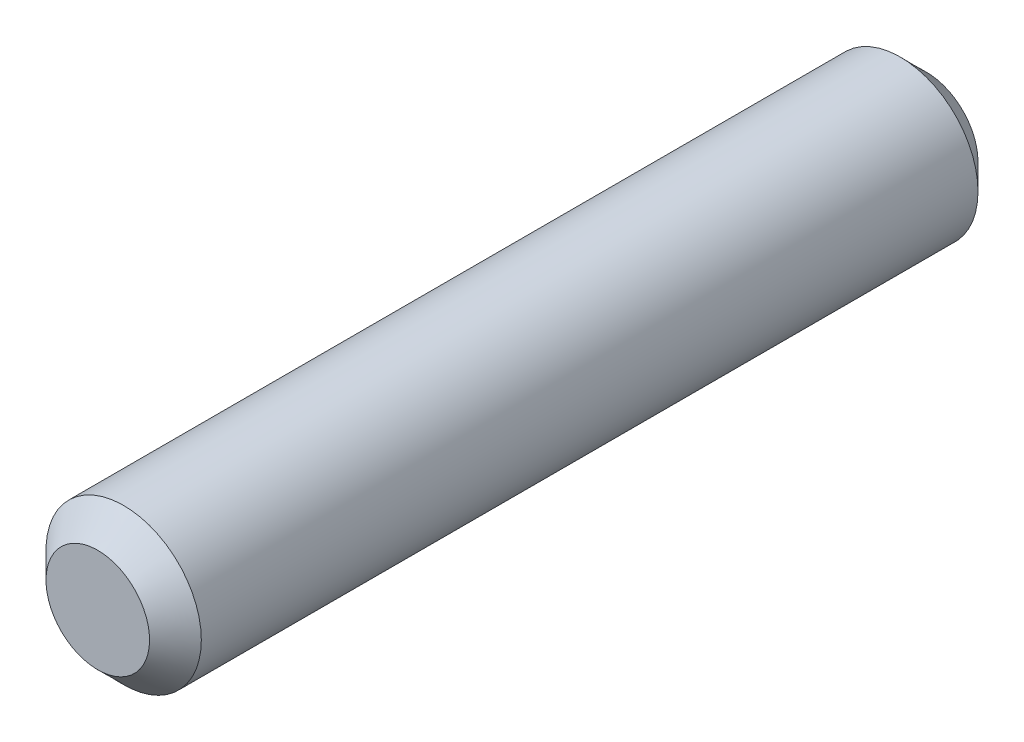
ISO-10303-21;
HEADER;
FILE_DESCRIPTION(('STEP AP214'),'2;1');
FILE_NAME('part.step','',(''),(''),'','','');
FILE_SCHEMA(('AUTOMOTIVE_DESIGN { 1 0 10303 214 1 1 1 1 }'));
ENDSEC;
DATA;
#1=APPLICATION_CONTEXT('core data for automotive mechanical design processes');
#2=APPLICATION_PROTOCOL_DEFINITION('international standard','automotive_design',2000,#1);
#3=PRODUCT_CONTEXT('',#1,'mechanical');
#4=PRODUCT('Part','Part','',(#3));
#5=PRODUCT_RELATED_PRODUCT_CATEGORY('part','',(#4));
#6=PRODUCT_DEFINITION_FORMATION('','',#4);
#7=PRODUCT_DEFINITION_CONTEXT('part definition',#1,'design');
#8=PRODUCT_DEFINITION('design','',#6,#7);
#9=PRODUCT_DEFINITION_SHAPE('','',#8);
#10=(LENGTH_UNIT() NAMED_UNIT(*) SI_UNIT(.MILLI.,.METRE.));
#11=(NAMED_UNIT(*) PLANE_ANGLE_UNIT() SI_UNIT($,.RADIAN.));
#12=(NAMED_UNIT(*) SI_UNIT($,.STERADIAN.) SOLID_ANGLE_UNIT());
#13=UNCERTAINTY_MEASURE_WITH_UNIT(LENGTH_MEASURE(1.E-05),#10,'distance_accuracy_value','');
#14=(GEOMETRIC_REPRESENTATION_CONTEXT(3) GLOBAL_UNCERTAINTY_ASSIGNED_CONTEXT((#13)) GLOBAL_UNIT_ASSIGNED_CONTEXT((#10,
#11,#12)) REPRESENTATION_CONTEXT('',''));
#15=CARTESIAN_POINT('',(0.,0.,0.));
#16=DIRECTION('',(0.,0.,1.));
#17=DIRECTION('',(1.,0.,0.));
#18=AXIS2_PLACEMENT_3D('',#15,#16,#17);
#19=CARTESIAN_POINT('',(0.,0.,8.));
#20=DIRECTION('',(0.,0.,-1.));
#21=DIRECTION('',(-1.,0.,0.));
#22=AXIS2_PLACEMENT_3D('',#19,#20,#21);
#23=CYLINDRICAL_SURFACE('',#22,1.5);
#24=CARTESIAN_POINT('',(0.,0.,-7.5));
#25=DIRECTION('',(0.,0.,1.));
#26=DIRECTION('',(1.,0.,0.));
#27=AXIS2_PLACEMENT_3D('',#24,#25,#26);
#28=CIRCLE('',#27,1.5);
#29=CARTESIAN_POINT('',(1.5,0.,-7.5));
#30=VERTEX_POINT('',#29);
#31=EDGE_CURVE('E41',#30,#30,#28,.T.);
#32=ORIENTED_EDGE('',*,*,#31,.T.);
#33=EDGE_LOOP('',(#32));
#34=FACE_BOUND('',#33,.T.);
#35=CARTESIAN_POINT('',(0.,0.,7.5));
#36=DIRECTION('',(0.,0.,1.));
#37=DIRECTION('',(1.,0.,0.));
#38=AXIS2_PLACEMENT_3D('',#35,#36,#37);
#39=CIRCLE('',#38,1.5);
#40=CARTESIAN_POINT('',(1.5,0.,7.5));
#41=VERTEX_POINT('',#40);
#42=EDGE_CURVE('E45',#41,#41,#39,.F.);
#43=ORIENTED_EDGE('',*,*,#42,.T.);
#44=EDGE_LOOP('',(#43));
#45=FACE_BOUND('',#44,.T.);
#46=ADVANCED_FACE('F30',(#34,#45),#23,.T.);
#47=CARTESIAN_POINT('',(0.,0.,8.));
#48=DIRECTION('',(0.,0.,1.));
#49=DIRECTION('',(1.,0.,0.));
#50=AXIS2_PLACEMENT_3D('',#47,#48,#49);
#51=PLANE('',#50);
#52=CARTESIAN_POINT('',(0.,0.,8.));
#53=DIRECTION('',(0.,0.,1.));
#54=DIRECTION('',(1.,0.,0.));
#55=AXIS2_PLACEMENT_3D('',#52,#53,#54);
#56=CIRCLE('',#55,1.);
#57=CARTESIAN_POINT('',(1.,0.,8.));
#58=VERTEX_POINT('',#57);
#59=EDGE_CURVE('E10',#58,#58,#56,.T.);
#60=ORIENTED_EDGE('',*,*,#59,.T.);
#61=EDGE_LOOP('',(#60));
#62=FACE_BOUND('',#61,.T.);
#63=ADVANCED_FACE('F61',(#62),#51,.T.);
#64=CARTESIAN_POINT('',(0.,0.,-8.));
#65=DIRECTION('',(0.,0.,1.));
#66=DIRECTION('',(1.,0.,0.));
#67=AXIS2_PLACEMENT_3D('',#64,#65,#66);
#68=PLANE('',#67);
#69=CARTESIAN_POINT('',(0.,0.,-8.));
#70=DIRECTION('',(0.,0.,1.));
#71=DIRECTION('',(1.,0.,0.));
#72=AXIS2_PLACEMENT_3D('',#69,#70,#71);
#73=CIRCLE('',#72,0.999999999999994);
#74=CARTESIAN_POINT('',(0.999999999999994,0.,-8.));
#75=VERTEX_POINT('',#74);
#76=EDGE_CURVE('E37',#75,#75,#73,.F.);
#77=ORIENTED_EDGE('',*,*,#76,.T.);
#78=EDGE_LOOP('',(#77));
#79=FACE_BOUND('',#78,.T.);
#80=ADVANCED_FACE('F58',(#79),#68,.F.);
#81=CARTESIAN_POINT('',(0.,0.,-7.5));
#82=DIRECTION('',(0.,0.,1.));
#83=DIRECTION('',(1.,0.,0.));
#84=AXIS2_PLACEMENT_3D('',#81,#82,#83);
#85=CONICAL_SURFACE('',#84,1.5,0.785398163397452);
#86=ORIENTED_EDGE('',*,*,#76,.F.);
#87=EDGE_LOOP('',(#86));
#88=FACE_BOUND('',#87,.T.);
#89=ORIENTED_EDGE('',*,*,#31,.F.);
#90=EDGE_LOOP('',(#89));
#91=FACE_BOUND('',#90,.T.);
#92=ADVANCED_FACE('F54',(#88,#91),#85,.T.);
#93=CARTESIAN_POINT('',(0.,0.,8.));
#94=DIRECTION('',(0.,0.,-1.));
#95=DIRECTION('',(-1.,0.,0.));
#96=AXIS2_PLACEMENT_3D('',#93,#94,#95);
#97=CONICAL_SURFACE('',#96,1.,0.785398163397445);
#98=ORIENTED_EDGE('',*,*,#42,.F.);
#99=EDGE_LOOP('',(#98));
#100=FACE_BOUND('',#99,.T.);
#101=ORIENTED_EDGE('',*,*,#59,.F.);
#102=EDGE_LOOP('',(#101));
#103=FACE_BOUND('',#102,.T.);
#104=ADVANCED_FACE('F32',(#100,#103),#97,.T.);
#105=CLOSED_SHELL('',(#46,#63,#80,#92,#104));
#106=MANIFOLD_SOLID_BREP('B2',#105);
#107=ADVANCED_BREP_SHAPE_REPRESENTATION('',(#18,#106),#14);
#108=SHAPE_DEFINITION_REPRESENTATION(#9,#107);
ENDSEC;
END-ISO-10303-21;
